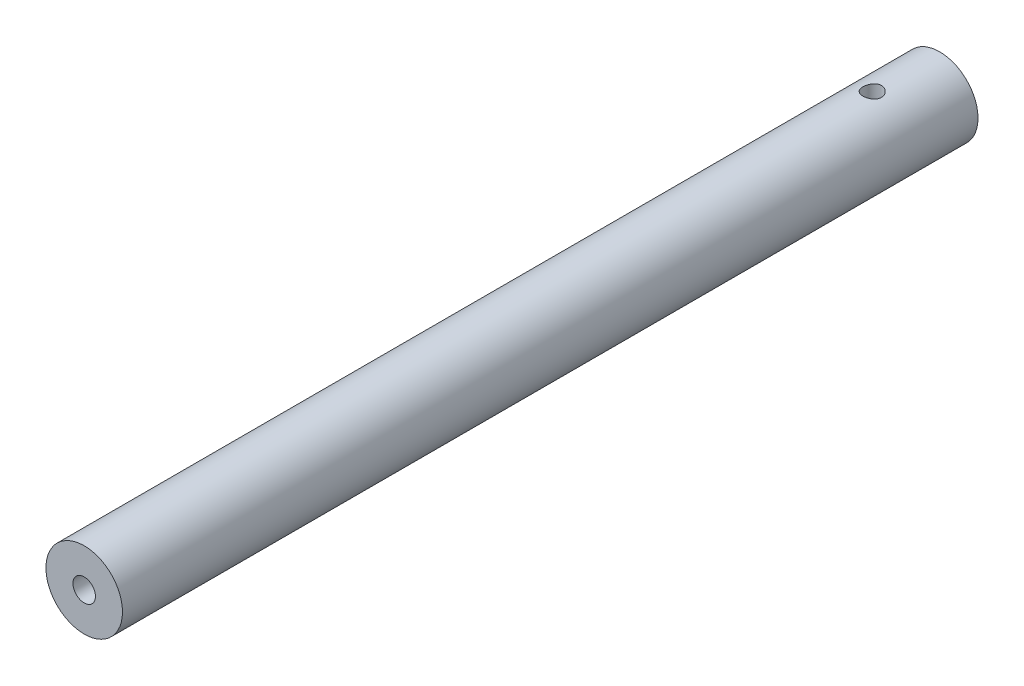
ISO-10303-21;
HEADER;
FILE_DESCRIPTION(('STEP AP214'),'2;1');
FILE_NAME('part.step','',(''),(''),'','','');
FILE_SCHEMA(('AUTOMOTIVE_DESIGN { 1 0 10303 214 1 1 1 1 }'));
ENDSEC;
DATA;
#1=APPLICATION_CONTEXT('core data for automotive mechanical design processes');
#2=APPLICATION_PROTOCOL_DEFINITION('international standard','automotive_design',2000,#1);
#3=PRODUCT_CONTEXT('',#1,'mechanical');
#4=PRODUCT('Part','Part','',(#3));
#5=PRODUCT_RELATED_PRODUCT_CATEGORY('part','',(#4));
#6=PRODUCT_DEFINITION_FORMATION('','',#4);
#7=PRODUCT_DEFINITION_CONTEXT('part definition',#1,'design');
#8=PRODUCT_DEFINITION('design','',#6,#7);
#9=PRODUCT_DEFINITION_SHAPE('','',#8);
#10=(LENGTH_UNIT() NAMED_UNIT(*) SI_UNIT(.MILLI.,.METRE.));
#11=(NAMED_UNIT(*) PLANE_ANGLE_UNIT() SI_UNIT($,.RADIAN.));
#12=(NAMED_UNIT(*) SI_UNIT($,.STERADIAN.) SOLID_ANGLE_UNIT());
#13=UNCERTAINTY_MEASURE_WITH_UNIT(LENGTH_MEASURE(1.E-05),#10,'distance_accuracy_value','');
#14=(GEOMETRIC_REPRESENTATION_CONTEXT(3) GLOBAL_UNCERTAINTY_ASSIGNED_CONTEXT((#13)) GLOBAL_UNIT_ASSIGNED_CONTEXT((#10,
#11,#12)) REPRESENTATION_CONTEXT('',''));
#15=CARTESIAN_POINT('',(0.,0.,0.));
#16=DIRECTION('',(0.,0.,1.));
#17=DIRECTION('',(1.,0.,0.));
#18=AXIS2_PLACEMENT_3D('',#15,#16,#17);
#19=CARTESIAN_POINT('',(0.,0.,241.3));
#20=DIRECTION('',(0.,0.,-1.));
#21=DIRECTION('',(-1.,0.,0.));
#22=AXIS2_PLACEMENT_3D('',#19,#20,#21);
#23=CYLINDRICAL_SURFACE('',#22,10.795);
#24=CARTESIAN_POINT('',(0.,0.,241.3));
#25=DIRECTION('',(0.,0.,1.));
#26=DIRECTION('',(1.,0.,0.));
#27=AXIS2_PLACEMENT_3D('',#24,#25,#26);
#28=CIRCLE('',#27,10.795);
#29=CARTESIAN_POINT('',(10.795,0.,241.3));
#30=VERTEX_POINT('',#29);
#31=EDGE_CURVE('E10',#30,#30,#28,.T.);
#32=ORIENTED_EDGE('',*,*,#31,.F.);
#33=EDGE_LOOP('',(#32));
#34=FACE_BOUND('',#33,.T.);
#35=CARTESIAN_POINT('',(0.,0.,0.));
#36=DIRECTION('',(0.,0.,1.));
#37=DIRECTION('',(1.,0.,0.));
#38=AXIS2_PLACEMENT_3D('',#35,#36,#37);
#39=CIRCLE('',#38,10.795);
#40=CARTESIAN_POINT('',(10.795,0.,0.));
#41=VERTEX_POINT('',#40);
#42=EDGE_CURVE('E51',#41,#41,#39,.T.);
#43=ORIENTED_EDGE('',*,*,#42,.T.);
#44=EDGE_LOOP('',(#43));
#45=FACE_BOUND('',#44,.T.);
#46=CARTESIAN_POINT('',(0.,-10.7950000000001,16.4465));
#47=CARTESIAN_POINT('',(0.144007766669044,-10.7949974695399,16.4465043239781));
#48=CARTESIAN_POINT('',(0.288064927462897,-10.7920894734277,16.4584885301304));
#49=CARTESIAN_POINT('',(0.572061358078014,-10.7807703931574,16.5060434484048));
#50=CARTESIAN_POINT('',(0.711998060616356,-10.772355950936,16.5416285535302));
#51=CARTESIAN_POINT('',(0.983610477038338,-10.7509572626029,16.6351854133534));
#52=CARTESIAN_POINT('',(1.11529553215935,-10.7379782980201,16.6931313022841));
#53=CARTESIAN_POINT('',(1.3670742616906,-10.7088382538192,16.8296764134814));
#54=CARTESIAN_POINT('',(1.48716774401357,-10.6926771214819,16.9082759779256));
#55=CARTESIAN_POINT('',(1.71466927438132,-10.6585838292443,17.0854976795648));
#56=CARTESIAN_POINT('',(1.82182213307574,-10.6406258826518,17.1844424659267));
#57=CARTESIAN_POINT('',(2.0181842952475,-10.6051372394768,17.3988545851348));
#58=CARTESIAN_POINT('',(2.10739170612663,-10.5876065881298,17.5143236585025));
#59=CARTESIAN_POINT('',(2.26650886997369,-10.5546992368149,17.7604601404169));
#60=CARTESIAN_POINT('',(2.33613723298895,-10.5393553688661,17.8913142424697));
#61=CARTESIAN_POINT('',(2.45231162032576,-10.5129332859799,18.1632990993017));
#62=CARTESIAN_POINT('',(2.49886105541242,-10.5018544407817,18.3044283320127));
#63=CARTESIAN_POINT('',(2.5666936272596,-10.4854811627541,18.5901619919296));
#64=CARTESIAN_POINT('',(2.58843358925284,-10.4800822932902,18.7346518494756));
#65=CARTESIAN_POINT('',(2.60745233451621,-10.4753673431376,19.0253209911165));
#66=CARTESIAN_POINT('',(2.60473480560786,-10.476050345394,19.1715000171905));
#67=CARTESIAN_POINT('',(2.57528111223915,-10.483327885649,19.457928409921));
#68=CARTESIAN_POINT('',(2.54908519103024,-10.4897894502973,19.5982372318582));
#69=CARTESIAN_POINT('',(2.47427838351105,-10.507684646299,19.8724076523235));
#70=CARTESIAN_POINT('',(2.42566599945282,-10.5191186098784,20.0062688193936));
#71=CARTESIAN_POINT('',(2.30693542282262,-10.5457949607109,20.2652133105373));
#72=CARTESIAN_POINT('',(2.23661775249649,-10.5610724192732,20.3902014061678));
#73=CARTESIAN_POINT('',(2.07661237787484,-10.5936940848508,20.6267995956732));
#74=CARTESIAN_POINT('',(1.98692150194911,-10.6110386300647,20.7384074943888));
#75=CARTESIAN_POINT('',(1.78789916915197,-10.646403235393,20.9481775057378));
#76=CARTESIAN_POINT('',(1.67811074717821,-10.6644290250159,21.0459056107274));
#77=CARTESIAN_POINT('',(1.44349024874292,-10.6987099584136,21.2216423760718));
#78=CARTESIAN_POINT('',(1.31865777341197,-10.7149650552195,21.2996505134126));
#79=CARTESIAN_POINT('',(1.05689995649454,-10.7439451103511,21.4338767215355));
#80=CARTESIAN_POINT('',(0.91993926107428,-10.756659268397,21.4900283300174));
#81=CARTESIAN_POINT('',(0.638148786722684,-10.7770459782317,21.5783930126783));
#82=CARTESIAN_POINT('',(0.493320410724506,-10.7847194256855,21.6106103397841));
#83=CARTESIAN_POINT('',(0.203619924250569,-10.7940290643981,21.6495384530411));
#84=CARTESIAN_POINT('',(0.0588316865562242,-10.79580524439,21.6568407869576));
#85=CARTESIAN_POINT('',(-0.229897117521223,-10.7935170381418,21.6473484504632));
#86=CARTESIAN_POINT('',(-0.37383775358591,-10.7894531389421,21.6305557894835));
#87=CARTESIAN_POINT('',(-0.654757974742591,-10.7760307199666,21.573838743381));
#88=CARTESIAN_POINT('',(-0.7918057816448,-10.7667452697059,21.5342334129712));
#89=CARTESIAN_POINT('',(-1.05730782679646,-10.7439236847792,21.4333766642784));
#90=CARTESIAN_POINT('',(-1.18576123208773,-10.7303871388245,21.3721231514857));
#91=CARTESIAN_POINT('',(-1.4328091954415,-10.7002263322078,21.2285371994022));
#92=CARTESIAN_POINT('',(-1.55120241104292,-10.6835541190093,21.1458686484423));
#93=CARTESIAN_POINT('',(-1.77264674481548,-10.6490530071722,20.9622326216251));
#94=CARTESIAN_POINT('',(-1.87569540413833,-10.6312239238097,20.8612622187708));
#95=CARTESIAN_POINT('',(-2.06593456625673,-10.5959204626381,20.6411505503182));
#96=CARTESIAN_POINT('',(-2.1527115344783,-10.5784633495619,20.5216485345793));
#97=CARTESIAN_POINT('',(-2.3049748666435,-10.5463356308065,20.2694257768451));
#98=CARTESIAN_POINT('',(-2.3704621838025,-10.531664900383,20.1367056270214));
#99=CARTESIAN_POINT('',(-2.47780850881029,-10.5069275229314,19.862536623722));
#100=CARTESIAN_POINT('',(-2.51980704850602,-10.4968337563773,19.7211449744095));
#101=CARTESIAN_POINT('',(-2.57936586640457,-10.4823591636729,19.4330298628862));
#102=CARTESIAN_POINT('',(-2.59693105197173,-10.4779771903376,19.2863074774137));
#103=CARTESIAN_POINT('',(-2.60688174011341,-10.4755054009937,18.9958918633151));
#104=CARTESIAN_POINT('',(-2.59992650016135,-10.4772508377053,18.8522222504964));
#105=CARTESIAN_POINT('',(-2.56253227246275,-10.4864587455007,18.5681687288127));
#106=CARTESIAN_POINT('',(-2.53209369493618,-10.4939211167177,18.4277847625964));
#107=CARTESIAN_POINT('',(-2.44894512937225,-10.5136335356897,18.1549473918007));
#108=CARTESIAN_POINT('',(-2.39635065884248,-10.525858726311,18.0224568645919));
#109=CARTESIAN_POINT('',(-2.27047620261894,-10.5537244541234,17.7680895102326));
#110=CARTESIAN_POINT('',(-2.19719354919128,-10.56936543172,17.6462140545457));
#111=CARTESIAN_POINT('',(-2.02992100962807,-10.602776777881,17.4133314734166));
#112=CARTESIAN_POINT('',(-1.93546995379092,-10.6205897551049,17.3026616463379));
#113=CARTESIAN_POINT('',(-1.72945122684424,-10.6560747562781,17.0985274986432));
#114=CARTESIAN_POINT('',(-1.61787953668736,-10.6737467461033,17.0050672293119));
#115=CARTESIAN_POINT('',(-1.37856080118326,-10.7073067512277,16.8365058246533));
#116=CARTESIAN_POINT('',(-1.25057684108331,-10.7231604445297,16.7617337409083));
#117=CARTESIAN_POINT('',(-0.983489287363875,-10.7509413676363,16.6348847546808));
#118=CARTESIAN_POINT('',(-0.844394164275291,-10.7628715536613,16.5827907554601));
#119=CARTESIAN_POINT('',(-0.587853786337889,-10.779588249322,16.5109737881505));
#120=CARTESIAN_POINT('',(-0.471683662486568,-10.7853291369439,16.4868465044689));
#121=CARTESIAN_POINT('',(-0.237020078431602,-10.7930359310616,16.4546083510283));
#122=CARTESIAN_POINT('',(-0.118526769617358,-10.795002082716,16.4464964411144));
#123=CARTESIAN_POINT('',(0.,-10.7950000000001,16.4465));
#124=B_SPLINE_CURVE_WITH_KNOTS('',3,(#46,#47,#48,#49,#50,#51,#52,#53,#54,#55,#56,#57,#58,#59,
#60,#61,#62,#63,#64,#65,#66,#67,#68,#69,#70,#71,#72,#73,#74,#75,#76,#77,#78,#79,#80,#81,#82,#83,
#84,#85,#86,#87,#88,#89,#90,#91,#92,#93,#94,#95,#96,#97,#98,#99,#100,#101,#102,#103,#104,#105,
#106,#107,#108,#109,#110,#111,#112,#113,#114,#115,#116,#117,#118,#119,#120,#121,#122,#123),
.UNSPECIFIED.,.T.,.F.,(4,2,2,2,2,2,2,2,2,2,2,2,2,2,2,2,2,2,2,2,2,2,2,2,2,2,2,2,2,2,2,2,2,2,2,2,
2,2,4),(0.,0.431589094909325,0.863441636655169,1.29479612454645,1.72615775930979,
2.16497653396063,2.60384156394758,3.0487244683354,3.49354160520853,3.93002887516108,
4.36645033050547,4.7930803568198,5.21973889239811,5.65044156023976,6.08121479287991,
6.52338833148259,6.96557359620136,7.40909316461771,7.85253390436083,8.2853700399752,
8.71817008079767,9.14505913853827,9.57198951005545,10.0060760160809,10.4402320064814,
10.8842529447321,11.3282539998059,11.7695887250589,12.2108347967792,12.640309027161,
13.0697757554183,13.4970304935413,13.9243403511971,14.3620651660684,14.7998928939305,
15.2449586883594,15.6896883694566,16.0449343752747,16.4001573080714),.UNSPECIFIED.);
#125=CARTESIAN_POINT('',(0.,-10.7950000000001,16.4465));
#126=VERTEX_POINT('',#125);
#127=EDGE_CURVE('E81',#126,#126,#124,.T.);
#128=ORIENTED_EDGE('',*,*,#127,.F.);
#129=EDGE_LOOP('',(#128));
#130=FACE_BOUND('',#129,.T.);
#131=CARTESIAN_POINT('',(0.,10.7949999999999,16.4465));
#132=CARTESIAN_POINT('',(-0.144007766669046,10.7949974695398,16.4465043239781));
#133=CARTESIAN_POINT('',(-0.2880649274629,10.7920894734277,16.4584885301304));
#134=CARTESIAN_POINT('',(-0.572061358078019,10.7807703931575,16.5060434484048));
#135=CARTESIAN_POINT('',(-0.71199806061636,10.772355950936,16.5416285535302));
#136=CARTESIAN_POINT('',(-0.98361047703834,10.7509572626029,16.6351854133534));
#137=CARTESIAN_POINT('',(-1.11529553215935,10.7379782980201,16.6931313022841));
#138=CARTESIAN_POINT('',(-1.3670742616906,10.7088382538192,16.8296764134814));
#139=CARTESIAN_POINT('',(-1.48716774401358,10.6926771214819,16.9082759779256));
#140=CARTESIAN_POINT('',(-1.71466927438133,10.6585838292443,17.0854976795648));
#141=CARTESIAN_POINT('',(-1.82182213307575,10.6406258826518,17.1844424659267));
#142=CARTESIAN_POINT('',(-2.0181842952475,10.6051372394768,17.3988545851348));
#143=CARTESIAN_POINT('',(-2.10739170612663,10.5876065881298,17.5143236585025));
#144=CARTESIAN_POINT('',(-2.26650886997369,10.5546992368149,17.7604601404169));
#145=CARTESIAN_POINT('',(-2.33613723298895,10.5393553688661,17.8913142424697));
#146=CARTESIAN_POINT('',(-2.45231162032576,10.5129332859799,18.1632990993017));
#147=CARTESIAN_POINT('',(-2.49886105541242,10.5018544407817,18.3044283320127));
#148=CARTESIAN_POINT('',(-2.5666936272596,10.4854811627541,18.5901619919296));
#149=CARTESIAN_POINT('',(-2.58843358925284,10.4800822932902,18.7346518494756));
#150=CARTESIAN_POINT('',(-2.60745233451621,10.4753673431376,19.0253209911165));
#151=CARTESIAN_POINT('',(-2.60473480560786,10.476050345394,19.1715000171905));
#152=CARTESIAN_POINT('',(-2.57528111223915,10.483327885649,19.4579284099211));
#153=CARTESIAN_POINT('',(-2.54908519103024,10.4897894502973,19.5982372318582));
#154=CARTESIAN_POINT('',(-2.47427838351105,10.507684646299,19.8724076523235));
#155=CARTESIAN_POINT('',(-2.42566599945282,10.5191186098784,20.0062688193936));
#156=CARTESIAN_POINT('',(-2.30693542282262,10.5457949607109,20.2652133105373));
#157=CARTESIAN_POINT('',(-2.23661775249649,10.5610724192732,20.3902014061678));
#158=CARTESIAN_POINT('',(-2.07661237787484,10.5936940848508,20.6267995956732));
#159=CARTESIAN_POINT('',(-1.9869215019491,10.6110386300647,20.7384074943888));
#160=CARTESIAN_POINT('',(-1.78789916915197,10.646403235393,20.9481775057378));
#161=CARTESIAN_POINT('',(-1.6781107471782,10.6644290250159,21.0459056107274));
#162=CARTESIAN_POINT('',(-1.44349024874291,10.6987099584136,21.2216423760718));
#163=CARTESIAN_POINT('',(-1.31865777341197,10.7149650552195,21.2996505134126));
#164=CARTESIAN_POINT('',(-1.05689995649453,10.7439451103511,21.4338767215355));
#165=CARTESIAN_POINT('',(-0.919939261074272,10.756659268397,21.4900283300174));
#166=CARTESIAN_POINT('',(-0.638148786722675,10.7770459782317,21.5783930126784));
#167=CARTESIAN_POINT('',(-0.493320410724496,10.7847194256855,21.6106103397841));
#168=CARTESIAN_POINT('',(-0.203619924250559,10.7940290643981,21.6495384530411));
#169=CARTESIAN_POINT('',(-0.0588316865562146,10.79580524439,21.6568407869576));
#170=CARTESIAN_POINT('',(0.229897117521231,10.7935170381418,21.6473484504632));
#171=CARTESIAN_POINT('',(0.373837753585917,10.7894531389421,21.6305557894835));
#172=CARTESIAN_POINT('',(0.654757974742599,10.7760307199666,21.573838743381));
#173=CARTESIAN_POINT('',(0.791805781644808,10.7667452697059,21.5342334129712));
#174=CARTESIAN_POINT('',(1.05730782679647,10.7439236847792,21.4333766642784));
#175=CARTESIAN_POINT('',(1.18576123208774,10.7303871388245,21.3721231514857));
#176=CARTESIAN_POINT('',(1.4328091954415,10.7002263322078,21.2285371994022));
#177=CARTESIAN_POINT('',(1.55120241104292,10.6835541190093,21.1458686484423));
#178=CARTESIAN_POINT('',(1.77264674481549,10.6490530071722,20.9622326216251));
#179=CARTESIAN_POINT('',(1.87569540413833,10.6312239238097,20.8612622187708));
#180=CARTESIAN_POINT('',(2.06593456625674,10.5959204626381,20.6411505503182));
#181=CARTESIAN_POINT('',(2.15271153447831,10.5784633495619,20.5216485345793));
#182=CARTESIAN_POINT('',(2.3049748666435,10.5463356308065,20.269425776845));
#183=CARTESIAN_POINT('',(2.3704621838025,10.531664900383,20.1367056270214));
#184=CARTESIAN_POINT('',(2.4778085088103,10.5069275229314,19.862536623722));
#185=CARTESIAN_POINT('',(2.51980704850603,10.4968337563773,19.7211449744095));
#186=CARTESIAN_POINT('',(2.57936586640457,10.4823591636729,19.4330298628862));
#187=CARTESIAN_POINT('',(2.59693105197173,10.4779771903376,19.2863074774137));
#188=CARTESIAN_POINT('',(2.60688174011341,10.4755054009937,18.9958918633151));
#189=CARTESIAN_POINT('',(2.59992650016135,10.4772508377053,18.8522222504964));
#190=CARTESIAN_POINT('',(2.56253227246275,10.4864587455007,18.5681687288127));
#191=CARTESIAN_POINT('',(2.53209369493618,10.4939211167177,18.4277847625964));
#192=CARTESIAN_POINT('',(2.44894512937225,10.5136335356897,18.1549473918007));
#193=CARTESIAN_POINT('',(2.39635065884248,10.525858726311,18.0224568645919));
#194=CARTESIAN_POINT('',(2.27047620261893,10.5537244541234,17.7680895102326));
#195=CARTESIAN_POINT('',(2.19719354919128,10.56936543172,17.6462140545457));
#196=CARTESIAN_POINT('',(2.02992100962807,10.602776777881,17.4133314734166));
#197=CARTESIAN_POINT('',(1.93546995379092,10.6205897551049,17.3026616463379));
#198=CARTESIAN_POINT('',(1.72945122684424,10.6560747562781,17.0985274986432));
#199=CARTESIAN_POINT('',(1.61787953668736,10.6737467461033,17.0050672293119));
#200=CARTESIAN_POINT('',(1.37856080118326,10.7073067512277,16.8365058246533));
#201=CARTESIAN_POINT('',(1.2505768410833,10.7231604445297,16.7617337409083));
#202=CARTESIAN_POINT('',(0.983489287363869,10.7509413676363,16.6348847546808));
#203=CARTESIAN_POINT('',(0.844394164275285,10.7628715536613,16.5827907554601));
#204=CARTESIAN_POINT('',(0.587853786337884,10.779588249322,16.5109737881505));
#205=CARTESIAN_POINT('',(0.471683662486564,10.785329136944,16.4868465044689));
#206=CARTESIAN_POINT('',(0.2370200784316,10.7930359310616,16.4546083510283));
#207=CARTESIAN_POINT('',(0.118526769617357,10.7950020827159,16.4464964411144));
#208=CARTESIAN_POINT('',(0.,10.7949999999999,16.4465));
#209=B_SPLINE_CURVE_WITH_KNOTS('',3,(#131,#132,#133,#134,#135,#136,#137,#138,#139,#140,#141,
#142,#143,#144,#145,#146,#147,#148,#149,#150,#151,#152,#153,#154,#155,#156,#157,#158,#159,#160,
#161,#162,#163,#164,#165,#166,#167,#168,#169,#170,#171,#172,#173,#174,#175,#176,#177,#178,#179,
#180,#181,#182,#183,#184,#185,#186,#187,#188,#189,#190,#191,#192,#193,#194,#195,#196,#197,#198,
#199,#200,#201,#202,#203,#204,#205,#206,#207,#208),.UNSPECIFIED.,.T.,.F.,(4,2,2,2,2,2,2,2,2,2,2,
2,2,2,2,2,2,2,2,2,2,2,2,2,2,2,2,2,2,2,2,2,2,2,2,2,2,2,4),(0.,0.431589094909328,
0.863441636655171,1.29479612454645,1.72615775930979,2.16497653396063,2.60384156394758,
3.0487244683354,3.49354160520853,3.93002887516108,4.36645033050548,4.79308035681981,
5.21973889239811,5.65044156023976,6.08121479287991,6.5233883314826,6.96557359620137,
7.40909316461772,7.85253390436083,8.2853700399752,8.71817008079768,9.14505913853827,
9.57198951005545,10.0060760160809,10.4402320064814,10.8842529447321,11.3282539998059,
11.7695887250589,12.2108347967792,12.640309027161,13.0697757554183,13.4970304935413,
13.9243403511971,14.3620651660684,14.7998928939305,15.2449586883594,15.6896883694566,
16.0449343752747,16.4001573080714),.UNSPECIFIED.);
#210=CARTESIAN_POINT('',(0.,10.7949999999999,16.4465));
#211=VERTEX_POINT('',#210);
#212=EDGE_CURVE('E87',#211,#211,#209,.T.);
#213=ORIENTED_EDGE('',*,*,#212,.F.);
#214=EDGE_LOOP('',(#213));
#215=FACE_BOUND('',#214,.T.);
#216=ADVANCED_FACE('F37',(#34,#45,#130,#215),#23,.T.);
#217=CARTESIAN_POINT('',(0.,0.,241.3));
#218=DIRECTION('',(0.,0.,-1.));
#219=DIRECTION('',(-1.,0.,0.));
#220=AXIS2_PLACEMENT_3D('',#217,#218,#219);
#221=CYLINDRICAL_SURFACE('',#220,3.175);
#222=CARTESIAN_POINT('',(0.,-3.17500000000006,16.4465));
#223=CARTESIAN_POINT('',(0.124123475975314,-3.17498963844618,16.4465106418092));
#224=CARTESIAN_POINT('',(0.248399817811962,-3.16764822022759,16.4554500467395));
#225=CARTESIAN_POINT('',(0.492915685238946,-3.1389318028652,16.4905902554952));
#226=CARTESIAN_POINT('',(0.613147071737957,-3.11753010274402,16.516823902031));
#227=CARTESIAN_POINT('',(0.845370064526023,-3.06269871701766,16.5846185779613));
#228=CARTESIAN_POINT('',(0.957408835942445,-3.02934570561062,16.626081941934));
#229=CARTESIAN_POINT('',(1.1719899729014,-2.95297497446786,16.7222331235048));
#230=CARTESIAN_POINT('',(1.27453147910821,-2.90995638137086,16.7769221361784));
#231=CARTESIAN_POINT('',(1.50418874828168,-2.79992252111317,16.9192990661828));
#232=CARTESIAN_POINT('',(1.62685974340384,-2.72984396144292,17.0117786184528));
#233=CARTESIAN_POINT('',(1.85222572926917,-2.58226149625843,17.2141003448508));
#234=CARTESIAN_POINT('',(1.95486191966328,-2.50473670147969,17.3239919612765));
#235=CARTESIAN_POINT('',(2.09419892563397,-2.38720547545904,17.5013513223961));
#236=CARTESIAN_POINT('',(2.13853064808069,-2.34746698005741,17.5631569207765));
#237=CARTESIAN_POINT('',(2.22185003224186,-2.26876311834293,17.6908056012042));
#238=CARTESIAN_POINT('',(2.26083592730141,-2.2297980112354,17.7566500076163));
#239=CARTESIAN_POINT('',(2.33318274771519,-2.15397803623534,17.8922601426137));
#240=CARTESIAN_POINT('',(2.36655779505138,-2.11711802939653,17.9620154187102));
#241=CARTESIAN_POINT('',(2.42746797872266,-2.04699254721169,18.1057036245187));
#242=CARTESIAN_POINT('',(2.4550081415199,-2.01372399022972,18.1796328884336));
#243=CARTESIAN_POINT('',(2.50658873716791,-1.94923911746055,18.34065517433));
#244=CARTESIAN_POINT('',(2.52985620476328,-1.91870498324858,18.4282818370175));
#245=CARTESIAN_POINT('',(2.56739303486915,-1.86818689698901,18.6082806500316));
#246=CARTESIAN_POINT('',(2.58168481380992,-1.84817668237134,18.7006403501036));
#247=CARTESIAN_POINT('',(2.60028691219318,-1.82192817278465,18.8894397334531));
#248=CARTESIAN_POINT('',(2.60448888485103,-1.81583940257808,18.9859124796543));
#249=CARTESIAN_POINT('',(2.60211315740838,-1.81923902416289,19.178462849654));
#250=CARTESIAN_POINT('',(2.59553081649723,-1.82873412215904,19.2745402855004));
#251=CARTESIAN_POINT('',(2.57094397805907,-1.86315400856163,19.4739309975834));
#252=CARTESIAN_POINT('',(2.55170022727413,-1.88974469136245,19.5767864608502));
#253=CARTESIAN_POINT('',(2.50232253625902,-1.95464781624411,19.7760915351039));
#254=CARTESIAN_POINT('',(2.47215411497204,-1.992997312748,19.8725197059534));
#255=CARTESIAN_POINT('',(2.41011212928527,-2.06731302203854,20.037679788695));
#256=CARTESIAN_POINT('',(2.38013051431426,-2.101892495004,20.1077810814778));
#257=CARTESIAN_POINT('',(2.31477445283779,-2.17366213153369,20.244044033851));
#258=CARTESIAN_POINT('',(2.27939711926158,-2.21085368695477,20.3102035578185));
#259=CARTESIAN_POINT('',(2.1654377234222,-2.32442703413849,20.5030818847659));
#260=CARTESIAN_POINT('',(2.0790542253791,-2.40277435290894,20.6241328491214));
#261=CARTESIAN_POINT('',(1.8822789307519,-2.56012511257145,20.8553233190861));
#262=CARTESIAN_POINT('',(1.77105880109223,-2.63902738873262,20.9648251687795));
#263=CARTESIAN_POINT('',(1.52707791149906,-2.7872784135014,21.1644605990421));
#264=CARTESIAN_POINT('',(1.39437058393792,-2.85665009058516,21.2546409662546));
#265=CARTESIAN_POINT('',(1.14717455706688,-2.96269415784096,21.3901696286));
#266=CARTESIAN_POINT('',(1.03734481071847,-3.00314655826616,21.4410551408327));
#267=CARTESIAN_POINT('',(0.808472770456135,-3.07266264818785,21.5278057635169));
#268=CARTESIAN_POINT('',(0.689437039605834,-3.10173436310677,21.5636814598098));
#269=CARTESIAN_POINT('',(0.444137934137643,-3.14626597447227,21.6184300343538));
#270=CARTESIAN_POINT('',(0.317832509624745,-3.16163592073425,21.637190572499));
#271=CARTESIAN_POINT('',(0.0629120037224772,-3.17693912736038,21.6558704359244));
#272=CARTESIAN_POINT('',(-0.0657020679860523,-3.17687897911894,21.6557978063164));
#273=CARTESIAN_POINT('',(-0.307380967024376,-3.16216462368221,21.637835240569));
#274=CARTESIAN_POINT('',(-0.420683678390857,-3.14901320282352,21.6217799880321));
#275=CARTESIAN_POINT('',(-0.64238324866903,-3.11136927044027,21.5755465378232));
#276=CARTESIAN_POINT('',(-0.750779218579745,-3.08687471272837,21.5453657920442));
#277=CARTESIAN_POINT('',(-0.964119386725494,-3.02717779548714,21.4711357905476));
#278=CARTESIAN_POINT('',(-1.06880671667249,-2.99162801371885,21.4266346376171));
#279=CARTESIAN_POINT('',(-1.26901924959807,-2.91235960230409,21.3260440279604));
#280=CARTESIAN_POINT('',(-1.36454176445309,-2.8686385869783,21.2699511864095));
#281=CARTESIAN_POINT('',(-1.58678190557679,-2.75401917991625,21.1201514119404));
#282=CARTESIAN_POINT('',(-1.70808861490194,-2.67976797972565,21.0209018277562));
#283=CARTESIAN_POINT('',(-1.87403957004751,-2.56382769666461,20.8589248884873));
#284=CARTESIAN_POINT('',(-1.92679707161643,-2.52431861471152,20.802595656466));
#285=CARTESIAN_POINT('',(-2.02691784622184,-2.4446489199743,20.6857649138503));
#286=CARTESIAN_POINT('',(-2.07428337510767,-2.40448858774874,20.6252651652178));
#287=CARTESIAN_POINT('',(-2.16433735799771,-2.32378756743906,20.499126533928));
#288=CARTESIAN_POINT('',(-2.20693199095687,-2.28325211743438,20.433417466267));
#289=CARTESIAN_POINT('',(-2.28640153755376,-2.20366818575306,20.2977045006103));
#290=CARTESIAN_POINT('',(-2.32327376010175,-2.16462041016163,20.2276986034009));
#291=CARTESIAN_POINT('',(-2.39086352498484,-2.08971969393375,20.0835812934821));
#292=CARTESIAN_POINT('',(-2.42160771889492,-2.05385331274567,20.0094895312605));
#293=CARTESIAN_POINT('',(-2.47664506007241,-1.98713910557179,19.8568537906104));
#294=CARTESIAN_POINT('',(-2.50094648664366,-1.95628485867467,19.7783156851153));
#295=CARTESIAN_POINT('',(-2.54327599370943,-1.9009579434824,19.6134580581763));
#296=CARTESIAN_POINT('',(-2.56100550798423,-1.87679933394887,19.5269514390611));
#297=CARTESIAN_POINT('',(-2.58765349222321,-1.83989414331905,19.3503256458425));
#298=CARTESIAN_POINT('',(-2.59659432871274,-1.82711860097365,19.2602162526084));
#299=CARTESIAN_POINT('',(-2.60495254879583,-1.81518976727652,19.0780256298435));
#300=CARTESIAN_POINT('',(-2.60430968129299,-1.81612265795785,18.9859355630084));
#301=CARTESIAN_POINT('',(-2.59341679087731,-1.8316354853639,18.8034382810021));
#302=CARTESIAN_POINT('',(-2.58315195253363,-1.8462364674874,18.7130338803149));
#303=CARTESIAN_POINT('',(-2.5499767392694,-1.89188125022432,18.5126542661852));
#304=CARTESIAN_POINT('',(-2.52441782222472,-1.92627916500785,18.4039143677314));
#305=CARTESIAN_POINT('',(-2.46129495688756,-2.0062986110638,18.1942475884249));
#306=CARTESIAN_POINT('',(-2.42369344788065,-2.05195515399703,18.0933463964546));
#307=CARTESIAN_POINT('',(-2.34811300923827,-2.13762622484279,17.9225798914479));
#308=CARTESIAN_POINT('',(-2.31236943659218,-2.17638361196674,17.8510580683786));
#309=CARTESIAN_POINT('',(-2.23498804969182,-2.25577612111849,17.7123322061681));
#310=CARTESIAN_POINT('',(-2.19334745554495,-2.29641212261647,17.6451302252751));
#311=CARTESIAN_POINT('',(-2.1042957731729,-2.37828173675716,17.5149528245458));
#312=CARTESIAN_POINT('',(-2.056880380111,-2.41951577478705,17.4519806127263));
#313=CARTESIAN_POINT('',(-1.95637146026664,-2.50149120394902,17.3303909156084));
#314=CARTESIAN_POINT('',(-1.90327499764465,-2.5422323281326,17.2717757086788));
#315=CARTESIAN_POINT('',(-1.73319854916752,-2.66387797753871,17.1005332294574));
#316=CARTESIAN_POINT('',(-1.60709272871656,-2.74259807229655,16.9949621509566));
#317=CARTESIAN_POINT('',(-1.40107169928093,-2.85020133536394,16.8540678587196));
#318=CARTESIAN_POINT('',(-1.32964369896838,-2.8843026658361,16.8100382853854));
#319=CARTESIAN_POINT('',(-1.18137409748013,-2.94813161513576,16.7284226506034));
#320=CARTESIAN_POINT('',(-1.10453586658899,-2.97786192184531,16.6908326269014));
#321=CARTESIAN_POINT('',(-0.918815482353822,-3.04122104053275,16.6112763557519));
#322=CARTESIAN_POINT('',(-0.807938741999636,-3.07272413283516,16.5721862774387));
#323=CARTESIAN_POINT('',(-0.579524537035567,-3.12384313970282,16.5090693635151));
#324=CARTESIAN_POINT('',(-0.462004057715166,-3.14348799034808,16.4850058555804));
#325=CARTESIAN_POINT('',(-0.28618633921551,-3.16259123109924,16.4616442336279));
#326=CARTESIAN_POINT('',(-0.229212891132938,-3.16723273070071,16.4559769862016));
#327=CARTESIAN_POINT('',(-0.114837276221349,-3.17343990585333,16.4484019264044));
#328=CARTESIAN_POINT('',(-0.0574350034855243,-3.17500479454741,16.4464950757716));
#329=CARTESIAN_POINT('',(0.,-3.17500000000006,16.4465));
#330=B_SPLINE_CURVE_WITH_KNOTS('',3,(#222,#223,#224,#225,#226,#227,#228,#229,#230,#231,#232,
#233,#234,#235,#236,#237,#238,#239,#240,#241,#242,#243,#244,#245,#246,#247,#248,#249,#250,#251,
#252,#253,#254,#255,#256,#257,#258,#259,#260,#261,#262,#263,#264,#265,#266,#267,#268,#269,#270,
#271,#272,#273,#274,#275,#276,#277,#278,#279,#280,#281,#282,#283,#284,#285,#286,#287,#288,#289,
#290,#291,#292,#293,#294,#295,#296,#297,#298,#299,#300,#301,#302,#303,#304,#305,#306,#307,#308,
#309,#310,#311,#312,#313,#314,#315,#316,#317,#318,#319,#320,#321,#322,#323,#324,#325,#326,#327,
#328,#329),.UNSPECIFIED.,.T.,.F.,(4,2,2,2,2,2,2,2,2,2,2,2,2,2,2,2,2,2,2,2,2,2,2,2,2,2,2,2,2,2,2,
2,2,2,2,2,2,2,2,2,2,2,2,2,2,2,2,2,2,2,2,2,2,4),(0.,0.37212111069442,0.744950943333161,
1.11543047898385,1.48594350384492,1.98985717146686,2.49522824914306,2.75246608989209,
3.00978873712747,3.26645370279311,3.5228966572058,3.8089939639097,4.09437388234913,
4.3828048387436,4.67135994815551,4.99347072450971,5.31660715494335,5.56744032301254,
5.81840817754306,6.32058007927769,6.84302172556961,7.36418362095618,7.74557593347979,
8.12669880951141,8.51030566083475,8.89374864408528,9.23772429777369,9.58176202538156,
9.93794272365027,10.2942275756089,10.8115239502991,11.0714401134858,11.3312471322991,
11.5954965586166,11.8598698799378,12.1230670389828,12.3859243178263,12.6595749069379,
12.9325272587597,13.2071963347532,13.4822890284082,13.8309834168997,14.1807761477988,
14.4470195601507,14.7133889016923,14.9799580383927,15.2466656030872,15.7900820157553,
16.0614094448483,16.3325693218519,16.6961622614931,17.0588643491009,17.2310099730123,
17.4031996182171),.UNSPECIFIED.);
#331=CARTESIAN_POINT('',(0.,-3.17500000000006,16.4465));
#332=VERTEX_POINT('',#331);
#333=EDGE_CURVE('E62',#332,#332,#330,.T.);
#334=ORIENTED_EDGE('',*,*,#333,.T.);
#335=EDGE_LOOP('',(#334));
#336=FACE_BOUND('',#335,.T.);
#337=CARTESIAN_POINT('',(0.,0.,241.3));
#338=DIRECTION('',(0.,0.,1.));
#339=DIRECTION('',(1.,0.,0.));
#340=AXIS2_PLACEMENT_3D('',#337,#338,#339);
#341=CIRCLE('',#340,3.175);
#342=CARTESIAN_POINT('',(3.175,0.,241.3));
#343=VERTEX_POINT('',#342);
#344=EDGE_CURVE('E57',#343,#343,#341,.T.);
#345=ORIENTED_EDGE('',*,*,#344,.T.);
#346=EDGE_LOOP('',(#345));
#347=FACE_BOUND('',#346,.T.);
#348=CARTESIAN_POINT('',(0.,0.,0.));
#349=DIRECTION('',(0.,0.,1.));
#350=DIRECTION('',(1.,0.,0.));
#351=AXIS2_PLACEMENT_3D('',#348,#349,#350);
#352=CIRCLE('',#351,3.175);
#353=CARTESIAN_POINT('',(3.175,0.,0.));
#354=VERTEX_POINT('',#353);
#355=EDGE_CURVE('E60',#354,#354,#352,.T.);
#356=ORIENTED_EDGE('',*,*,#355,.F.);
#357=EDGE_LOOP('',(#356));
#358=FACE_BOUND('',#357,.T.);
#359=CARTESIAN_POINT('',(0.,3.17499999999994,16.4465));
#360=CARTESIAN_POINT('',(-0.124123475975318,3.17498963844601,16.4465106418092));
#361=CARTESIAN_POINT('',(-0.248399817811972,3.16764822022754,16.4554500467395));
#362=CARTESIAN_POINT('',(-0.492915685238956,3.13893180286524,16.4905902554953));
#363=CARTESIAN_POINT('',(-0.613147071737963,3.11753010274403,16.516823902031));
#364=CARTESIAN_POINT('',(-0.845370064526023,3.06269871701764,16.5846185779613));
#365=CARTESIAN_POINT('',(-0.957408835942444,3.02934570561062,16.626081941934));
#366=CARTESIAN_POINT('',(-1.1719899729014,2.95297497446787,16.7222331235048));
#367=CARTESIAN_POINT('',(-1.27453147910821,2.90995638137086,16.7769221361784));
#368=CARTESIAN_POINT('',(-1.50418874828168,2.79992252111317,16.9192990661828));
#369=CARTESIAN_POINT('',(-1.62685974340385,2.72984396144292,17.0117786184528));
#370=CARTESIAN_POINT('',(-1.85222572926917,2.58226149625843,17.2141003448508));
#371=CARTESIAN_POINT('',(-1.95486191966329,2.50473670147969,17.3239919612765));
#372=CARTESIAN_POINT('',(-2.09419892563397,2.38720547545904,17.5013513223961));
#373=CARTESIAN_POINT('',(-2.1385306480807,2.34746698005741,17.5631569207765));
#374=CARTESIAN_POINT('',(-2.22185003224186,2.26876311834293,17.6908056012042));
#375=CARTESIAN_POINT('',(-2.26083592730141,2.2297980112354,17.7566500076163));
#376=CARTESIAN_POINT('',(-2.33318274771519,2.15397803623534,17.8922601426137));
#377=CARTESIAN_POINT('',(-2.36655779505139,2.11711802939653,17.9620154187102));
#378=CARTESIAN_POINT('',(-2.42746797872267,2.04699254721168,18.1057036245187));
#379=CARTESIAN_POINT('',(-2.4550081415199,2.01372399022972,18.1796328884336));
#380=CARTESIAN_POINT('',(-2.50658873716792,1.94923911746055,18.34065517433));
#381=CARTESIAN_POINT('',(-2.52985620476328,1.91870498324857,18.4282818370175));
#382=CARTESIAN_POINT('',(-2.56739303486915,1.86818689698901,18.6082806500316));
#383=CARTESIAN_POINT('',(-2.58168481380992,1.84817668237134,18.7006403501036));
#384=CARTESIAN_POINT('',(-2.60028691219318,1.82192817278465,18.8894397334532));
#385=CARTESIAN_POINT('',(-2.60448888485103,1.81583940257808,18.9859124796544));
#386=CARTESIAN_POINT('',(-2.60211315740838,1.81923902416289,19.178462849654));
#387=CARTESIAN_POINT('',(-2.59553081649723,1.82873412215904,19.2745402855004));
#388=CARTESIAN_POINT('',(-2.57094397805907,1.86315400856163,19.4739309975834));
#389=CARTESIAN_POINT('',(-2.55170022727413,1.88974469136245,19.5767864608502));
#390=CARTESIAN_POINT('',(-2.50232253625902,1.95464781624411,19.7760915351039));
#391=CARTESIAN_POINT('',(-2.47215411497204,1.992997312748,19.8725197059534));
#392=CARTESIAN_POINT('',(-2.41011212928527,2.06731302203854,20.037679788695));
#393=CARTESIAN_POINT('',(-2.38013051431426,2.101892495004,20.1077810814778));
#394=CARTESIAN_POINT('',(-2.31477445283778,2.17366213153369,20.244044033851));
#395=CARTESIAN_POINT('',(-2.27939711926157,2.21085368695477,20.3102035578185));
#396=CARTESIAN_POINT('',(-2.16543772342219,2.3244270341385,20.5030818847659));
#397=CARTESIAN_POINT('',(-2.07905422537909,2.40277435290894,20.6241328491214));
#398=CARTESIAN_POINT('',(-1.88227893075189,2.56012511257145,20.8553233190861));
#399=CARTESIAN_POINT('',(-1.77105880109221,2.63902738873263,20.9648251687795));
#400=CARTESIAN_POINT('',(-1.52707791149904,2.78727841350141,21.1644605990421));
#401=CARTESIAN_POINT('',(-1.39437058393791,2.85665009058516,21.2546409662547));
#402=CARTESIAN_POINT('',(-1.14717455706686,2.96269415784097,21.3901696286));
#403=CARTESIAN_POINT('',(-1.03734481071845,3.00314655826617,21.4410551408327));
#404=CARTESIAN_POINT('',(-0.808472770456119,3.07266264818786,21.5278057635169));
#405=CARTESIAN_POINT('',(-0.689437039605819,3.10173436310677,21.5636814598098));
#406=CARTESIAN_POINT('',(-0.444137934137628,3.14626597447227,21.6184300343538));
#407=CARTESIAN_POINT('',(-0.31783250962473,3.16163592073426,21.637190572499));
#408=CARTESIAN_POINT('',(-0.0629120037224626,3.17693912736038,21.6558704359244));
#409=CARTESIAN_POINT('',(0.0657020679860657,3.17687897911894,21.6557978063164));
#410=CARTESIAN_POINT('',(0.307380967024388,3.1621646236822,21.637835240569));
#411=CARTESIAN_POINT('',(0.420683678390869,3.14901320282352,21.6217799880321));
#412=CARTESIAN_POINT('',(0.642383248669042,3.11136927044027,21.5755465378232));
#413=CARTESIAN_POINT('',(0.750779218579756,3.08687471272836,21.5453657920442));
#414=CARTESIAN_POINT('',(0.964119386725504,3.02717779548714,21.4711357905476));
#415=CARTESIAN_POINT('',(1.0688067166725,2.99162801371885,21.4266346376171));
#416=CARTESIAN_POINT('',(1.26901924959808,2.91235960230409,21.3260440279604));
#417=CARTESIAN_POINT('',(1.3645417644531,2.8686385869783,21.2699511864095));
#418=CARTESIAN_POINT('',(1.58678190557679,2.75401917991624,21.1201514119404));
#419=CARTESIAN_POINT('',(1.70808861490194,2.67976797972564,21.0209018277561));
#420=CARTESIAN_POINT('',(1.87403957004752,2.5638276966646,20.8589248884873));
#421=CARTESIAN_POINT('',(1.92679707161644,2.52431861471151,20.802595656466));
#422=CARTESIAN_POINT('',(2.02691784622184,2.44464891997429,20.6857649138503));
#423=CARTESIAN_POINT('',(2.07428337510767,2.40448858774874,20.6252651652178));
#424=CARTESIAN_POINT('',(2.16433735799772,2.32378756743905,20.499126533928));
#425=CARTESIAN_POINT('',(2.20693199095687,2.28325211743437,20.433417466267));
#426=CARTESIAN_POINT('',(2.28640153755377,2.20366818575306,20.2977045006103));
#427=CARTESIAN_POINT('',(2.32327376010175,2.16462041016162,20.2276986034009));
#428=CARTESIAN_POINT('',(2.39086352498484,2.08971969393375,20.0835812934821));
#429=CARTESIAN_POINT('',(2.42160771889493,2.05385331274566,20.0094895312605));
#430=CARTESIAN_POINT('',(2.47664506007242,1.98713910557178,19.8568537906104));
#431=CARTESIAN_POINT('',(2.50094648664367,1.95628485867467,19.7783156851153));
#432=CARTESIAN_POINT('',(2.54327599370944,1.9009579434824,19.6134580581763));
#433=CARTESIAN_POINT('',(2.56100550798423,1.87679933394887,19.5269514390611));
#434=CARTESIAN_POINT('',(2.58765349222321,1.83989414331905,19.3503256458425));
#435=CARTESIAN_POINT('',(2.59659432871274,1.82711860097365,19.2602162526084));
#436=CARTESIAN_POINT('',(2.60495254879583,1.81518976727652,19.0780256298435));
#437=CARTESIAN_POINT('',(2.60430968129299,1.81612265795785,18.9859355630084));
#438=CARTESIAN_POINT('',(2.59341679087731,1.8316354853639,18.8034382810021));
#439=CARTESIAN_POINT('',(2.58315195253363,1.8462364674874,18.7130338803149));
#440=CARTESIAN_POINT('',(2.54997673926939,1.89188125022432,18.5126542661852));
#441=CARTESIAN_POINT('',(2.52441782222471,1.92627916500785,18.4039143677314));
#442=CARTESIAN_POINT('',(2.46129495688755,2.00629861106381,18.1942475884249));
#443=CARTESIAN_POINT('',(2.42369344788065,2.05195515399703,18.0933463964546));
#444=CARTESIAN_POINT('',(2.34811300923826,2.1376262248428,17.9225798914479));
#445=CARTESIAN_POINT('',(2.31236943659217,2.17638361196675,17.8510580683786));
#446=CARTESIAN_POINT('',(2.23498804969181,2.2557761211185,17.712332206168));
#447=CARTESIAN_POINT('',(2.19334745554494,2.29641212261648,17.6451302252751));
#448=CARTESIAN_POINT('',(2.10429577317288,2.37828173675717,17.5149528245458));
#449=CARTESIAN_POINT('',(2.05688038011098,2.41951577478706,17.4519806127262));
#450=CARTESIAN_POINT('',(1.95637146026663,2.50149120394903,17.3303909156083));
#451=CARTESIAN_POINT('',(1.90327499764464,2.54223232813261,17.2717757086788));
#452=CARTESIAN_POINT('',(1.7331985491675,2.66387797753872,17.1005332294574));
#453=CARTESIAN_POINT('',(1.60709272871654,2.74259807229656,16.9949621509566));
#454=CARTESIAN_POINT('',(1.40107169928092,2.85020133536395,16.8540678587196));
#455=CARTESIAN_POINT('',(1.32964369896837,2.88430266583611,16.8100382853854));
#456=CARTESIAN_POINT('',(1.18137409748011,2.94813161513576,16.7284226506034));
#457=CARTESIAN_POINT('',(1.10453586658897,2.97786192184532,16.6908326269014));
#458=CARTESIAN_POINT('',(0.918815482353798,3.04122104053276,16.6112763557519));
#459=CARTESIAN_POINT('',(0.80793874199961,3.07272413283517,16.5721862774387));
#460=CARTESIAN_POINT('',(0.579524537035541,3.12384313970282,16.5090693635151));
#461=CARTESIAN_POINT('',(0.462004057715141,3.14348799034806,16.4850058555804));
#462=CARTESIAN_POINT('',(0.286186339215491,3.16259123109925,16.4616442336279));
#463=CARTESIAN_POINT('',(0.229212891132924,3.16723273070073,16.4559769862016));
#464=CARTESIAN_POINT('',(0.114837276221343,3.17343990585331,16.4484019264044));
#465=CARTESIAN_POINT('',(0.0574350034855212,3.17500479454732,16.4464950757716));
#466=CARTESIAN_POINT('',(0.,3.17499999999994,16.4465));
#467=B_SPLINE_CURVE_WITH_KNOTS('',3,(#359,#360,#361,#362,#363,#364,#365,#366,#367,#368,#369,
#370,#371,#372,#373,#374,#375,#376,#377,#378,#379,#380,#381,#382,#383,#384,#385,#386,#387,#388,
#389,#390,#391,#392,#393,#394,#395,#396,#397,#398,#399,#400,#401,#402,#403,#404,#405,#406,#407,
#408,#409,#410,#411,#412,#413,#414,#415,#416,#417,#418,#419,#420,#421,#422,#423,#424,#425,#426,
#427,#428,#429,#430,#431,#432,#433,#434,#435,#436,#437,#438,#439,#440,#441,#442,#443,#444,#445,
#446,#447,#448,#449,#450,#451,#452,#453,#454,#455,#456,#457,#458,#459,#460,#461,#462,#463,#464,
#465,#466),.UNSPECIFIED.,.T.,.F.,(4,2,2,2,2,2,2,2,2,2,2,2,2,2,2,2,2,2,2,2,2,2,2,2,2,2,2,2,2,2,2,
2,2,2,2,2,2,2,2,2,2,2,2,2,2,2,2,2,2,2,2,2,2,4),(0.,0.372121110694426,0.744950943333157,
1.11543047898384,1.48594350384492,1.98985717146686,2.49522824914306,2.75246608989209,
3.00978873712747,3.26645370279311,3.52289665720581,3.8089939639097,4.09437388234913,
4.3828048387436,4.67135994815551,4.99347072450971,5.31660715494335,5.56744032301254,
5.81840817754306,6.3205800792777,6.84302172556962,7.36418362095619,7.7455759334798,
8.12669880951142,8.51030566083476,8.89374864408529,9.2377242977737,9.58176202538156,
9.93794272365028,10.2942275756089,10.8115239502991,11.0714401134858,11.3312471322991,
11.5954965586166,11.8598698799378,12.1230670389828,12.3859243178263,12.6595749069379,
12.9325272587597,13.2071963347532,13.4822890284082,13.8309834168997,14.1807761477988,
14.4470195601507,14.7133889016923,14.9799580383927,15.2466656030872,15.7900820157553,
16.0614094448484,16.332569321852,16.6961622614931,17.0588643491009,17.2310099730124,
17.4031996182171),.UNSPECIFIED.);
#468=CARTESIAN_POINT('',(0.,3.17499999999994,16.4465));
#469=VERTEX_POINT('',#468);
#470=EDGE_CURVE('E41',#469,#469,#467,.T.);
#471=ORIENTED_EDGE('',*,*,#470,.T.);
#472=EDGE_LOOP('',(#471));
#473=FACE_BOUND('',#472,.T.);
#474=ADVANCED_FACE('F68',(#336,#347,#358,#473),#221,.F.);
#475=CARTESIAN_POINT('',(0.,0.,241.3));
#476=DIRECTION('',(0.,0.,1.));
#477=DIRECTION('',(1.,0.,0.));
#478=AXIS2_PLACEMENT_3D('',#475,#476,#477);
#479=PLANE('',#478);
#480=ORIENTED_EDGE('',*,*,#31,.T.);
#481=EDGE_LOOP('',(#480));
#482=FACE_BOUND('',#481,.T.);
#483=ORIENTED_EDGE('',*,*,#344,.F.);
#484=EDGE_LOOP('',(#483));
#485=FACE_BOUND('',#484,.T.);
#486=ADVANCED_FACE('F105',(#482,#485),#479,.T.);
#487=CARTESIAN_POINT('',(0.,0.,0.));
#488=DIRECTION('',(0.,0.,1.));
#489=DIRECTION('',(1.,0.,0.));
#490=AXIS2_PLACEMENT_3D('',#487,#488,#489);
#491=PLANE('',#490);
#492=ORIENTED_EDGE('',*,*,#42,.F.);
#493=EDGE_LOOP('',(#492));
#494=FACE_BOUND('',#493,.T.);
#495=ORIENTED_EDGE('',*,*,#355,.T.);
#496=EDGE_LOOP('',(#495));
#497=FACE_BOUND('',#496,.T.);
#498=ADVANCED_FACE('F101',(#494,#497),#491,.F.);
#499=CARTESIAN_POINT('',(0.,254.,19.05));
#500=DIRECTION('',(0.,-1.,0.));
#501=DIRECTION('',(0.,0.,-1.));
#502=AXIS2_PLACEMENT_3D('',#499,#500,#501);
#503=CYLINDRICAL_SURFACE('',#502,2.6035);
#504=ORIENTED_EDGE('',*,*,#333,.F.);
#505=EDGE_LOOP('',(#504));
#506=FACE_BOUND('',#505,.T.);
#507=ORIENTED_EDGE('',*,*,#127,.T.);
#508=EDGE_LOOP('',(#507));
#509=FACE_BOUND('',#508,.T.);
#510=ADVANCED_FACE('F74',(#506,#509),#503,.F.);
#511=ORIENTED_EDGE('',*,*,#470,.F.);
#512=EDGE_LOOP('',(#511));
#513=FACE_BOUND('',#512,.T.);
#514=ORIENTED_EDGE('',*,*,#212,.T.);
#515=EDGE_LOOP('',(#514));
#516=FACE_BOUND('',#515,.T.);
#517=ADVANCED_FACE('F71',(#513,#516),#503,.F.);
#518=CLOSED_SHELL('',(#216,#474,#486,#498,#510,#517));
#519=MANIFOLD_SOLID_BREP('B2',#518);
#520=ADVANCED_BREP_SHAPE_REPRESENTATION('',(#18,#519),#14);
#521=SHAPE_DEFINITION_REPRESENTATION(#9,#520);
ENDSEC;
END-ISO-10303-21;
